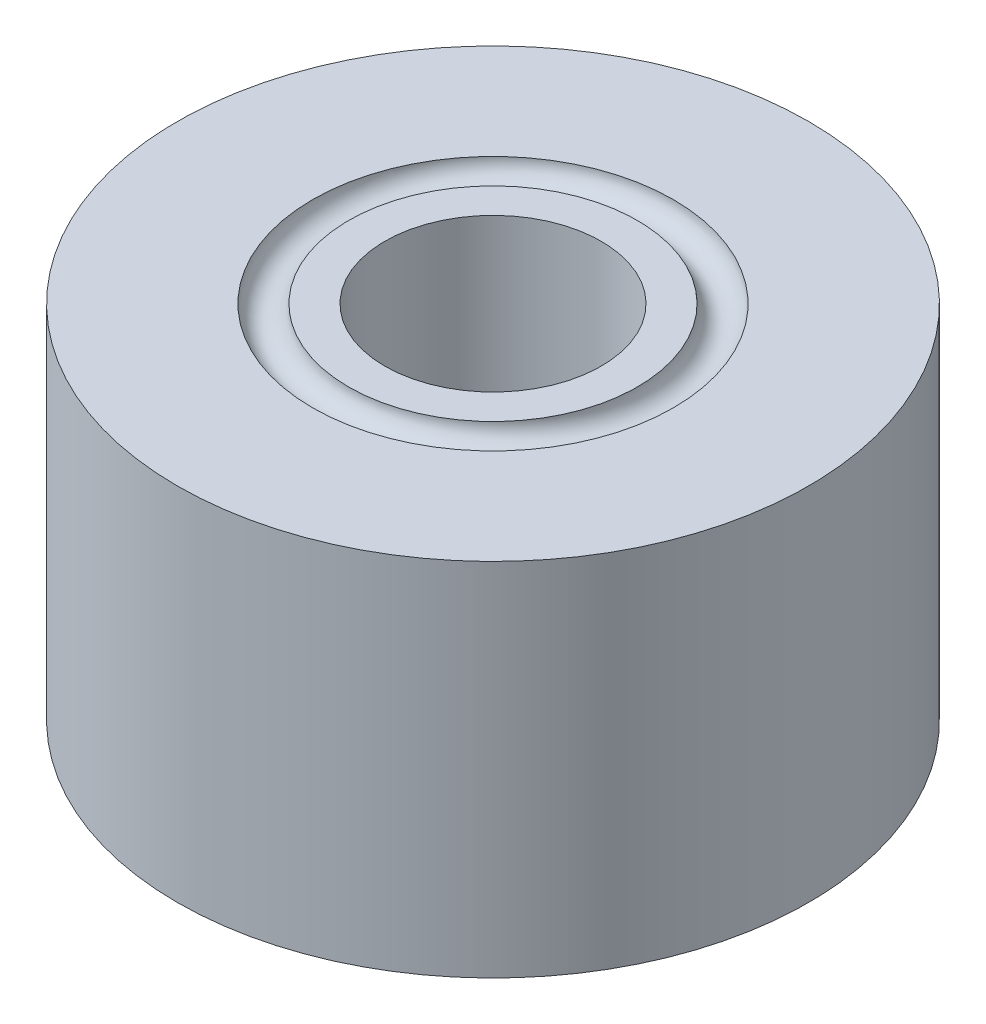
ISO-10303-21;
HEADER;
FILE_DESCRIPTION(('STEP AP214'),'2;1');
FILE_NAME('part.step','',(''),(''),'','','');
FILE_SCHEMA(('AUTOMOTIVE_DESIGN { 1 0 10303 214 1 1 1 1 }'));
ENDSEC;
DATA;
#1=APPLICATION_CONTEXT('core data for automotive mechanical design processes');
#2=APPLICATION_PROTOCOL_DEFINITION('international standard','automotive_design',2000,#1);
#3=PRODUCT_CONTEXT('',#1,'mechanical');
#4=PRODUCT('Part','Part','',(#3));
#5=PRODUCT_RELATED_PRODUCT_CATEGORY('part','',(#4));
#6=PRODUCT_DEFINITION_FORMATION('','',#4);
#7=PRODUCT_DEFINITION_CONTEXT('part definition',#1,'design');
#8=PRODUCT_DEFINITION('design','',#6,#7);
#9=PRODUCT_DEFINITION_SHAPE('','',#8);
#10=(LENGTH_UNIT() NAMED_UNIT(*) SI_UNIT(.MILLI.,.METRE.));
#11=(NAMED_UNIT(*) PLANE_ANGLE_UNIT() SI_UNIT($,.RADIAN.));
#12=(NAMED_UNIT(*) SI_UNIT($,.STERADIAN.) SOLID_ANGLE_UNIT());
#13=UNCERTAINTY_MEASURE_WITH_UNIT(LENGTH_MEASURE(1.E-05),#10,'distance_accuracy_value','');
#14=(GEOMETRIC_REPRESENTATION_CONTEXT(3) GLOBAL_UNCERTAINTY_ASSIGNED_CONTEXT((#13)) GLOBAL_UNIT_ASSIGNED_CONTEXT((#10,
#11,#12)) REPRESENTATION_CONTEXT('',''));
#15=CARTESIAN_POINT('',(0.,0.,0.));
#16=DIRECTION('',(0.,0.,1.));
#17=DIRECTION('',(1.,0.,0.));
#18=AXIS2_PLACEMENT_3D('',#15,#16,#17);
#19=CARTESIAN_POINT('',(0.,20.,0.));
#20=DIRECTION('',(0.,-1.,0.));
#21=DIRECTION('',(0.,0.,-1.));
#22=AXIS2_PLACEMENT_3D('',#19,#20,#21);
#23=CYLINDRICAL_SURFACE('',#22,2.5);
#24=CARTESIAN_POINT('',(0.,0.,0.));
#25=DIRECTION('',(0.,1.,0.));
#26=DIRECTION('',(0.,0.,1.));
#27=AXIS2_PLACEMENT_3D('',#24,#25,#26);
#28=CIRCLE('',#27,2.5);
#29=CARTESIAN_POINT('',(0.,0.,2.5));
#30=VERTEX_POINT('',#29);
#31=EDGE_CURVE('E65',#30,#30,#28,.T.);
#32=ORIENTED_EDGE('',*,*,#31,.F.);
#33=EDGE_LOOP('',(#32));
#34=FACE_BOUND('',#33,.T.);
#35=CARTESIAN_POINT('',(0.,9.,0.));
#36=DIRECTION('',(0.,1.,0.));
#37=DIRECTION('',(0.,0.,1.));
#38=AXIS2_PLACEMENT_3D('',#35,#36,#37);
#39=CIRCLE('',#38,2.5);
#40=CARTESIAN_POINT('',(0.,9.,2.5));
#41=VERTEX_POINT('',#40);
#42=EDGE_CURVE('E49',#41,#41,#39,.T.);
#43=ORIENTED_EDGE('',*,*,#42,.T.);
#44=EDGE_LOOP('',(#43));
#45=FACE_BOUND('',#44,.T.);
#46=ADVANCED_FACE('F45',(#34,#45),#23,.F.);
#47=CARTESIAN_POINT('',(0.,20.,0.));
#48=DIRECTION('',(0.,1.,0.));
#49=DIRECTION('',(0.,0.,1.));
#50=AXIS2_PLACEMENT_3D('',#47,#48,#49);
#51=PLANE('',#50);
#52=CARTESIAN_POINT('',(0.,20.,0.));
#53=DIRECTION('',(0.,1.,0.));
#54=DIRECTION('',(0.,0.,1.));
#55=AXIS2_PLACEMENT_3D('',#52,#53,#54);
#56=CIRCLE('',#55,17.5);
#57=CARTESIAN_POINT('',(0.,20.,17.5));
#58=VERTEX_POINT('',#57);
#59=EDGE_CURVE('E68',#58,#58,#56,.T.);
#60=ORIENTED_EDGE('',*,*,#59,.T.);
#61=EDGE_LOOP('',(#60));
#62=FACE_BOUND('',#61,.T.);
#63=CARTESIAN_POINT('',(0.,20.,0.));
#64=DIRECTION('',(0.,1.,0.));
#65=DIRECTION('',(0.,0.,1.));
#66=AXIS2_PLACEMENT_3D('',#63,#64,#65);
#67=CIRCLE('',#66,10.);
#68=CARTESIAN_POINT('',(0.,20.,10.));
#69=VERTEX_POINT('',#68);
#70=EDGE_CURVE('E12',#69,#69,#67,.T.);
#71=ORIENTED_EDGE('',*,*,#70,.F.);
#72=EDGE_LOOP('',(#71));
#73=FACE_BOUND('',#72,.T.);
#74=ADVANCED_FACE('F78',(#62,#73),#51,.T.);
#75=CARTESIAN_POINT('',(0.,20.,0.));
#76=DIRECTION('',(0.,-1.,0.));
#77=DIRECTION('',(0.,0.,-1.));
#78=AXIS2_PLACEMENT_3D('',#75,#76,#77);
#79=CYLINDRICAL_SURFACE('',#78,17.5);
#80=ORIENTED_EDGE('',*,*,#59,.F.);
#81=EDGE_LOOP('',(#80));
#82=FACE_BOUND('',#81,.T.);
#83=CARTESIAN_POINT('',(0.,0.,0.));
#84=DIRECTION('',(0.,1.,0.));
#85=DIRECTION('',(0.,0.,1.));
#86=AXIS2_PLACEMENT_3D('',#83,#84,#85);
#87=CIRCLE('',#86,17.5);
#88=CARTESIAN_POINT('',(0.,0.,17.5));
#89=VERTEX_POINT('',#88);
#90=EDGE_CURVE('E64',#89,#89,#87,.T.);
#91=ORIENTED_EDGE('',*,*,#90,.T.);
#92=EDGE_LOOP('',(#91));
#93=FACE_BOUND('',#92,.T.);
#94=ADVANCED_FACE('F47',(#82,#93),#79,.T.);
#95=CARTESIAN_POINT('',(0.,0.,0.));
#96=DIRECTION('',(0.,1.,0.));
#97=DIRECTION('',(0.,0.,1.));
#98=AXIS2_PLACEMENT_3D('',#95,#96,#97);
#99=PLANE('',#98);
#100=ORIENTED_EDGE('',*,*,#31,.T.);
#101=EDGE_LOOP('',(#100));
#102=FACE_BOUND('',#101,.T.);
#103=ORIENTED_EDGE('',*,*,#90,.F.);
#104=EDGE_LOOP('',(#103));
#105=FACE_BOUND('',#104,.T.);
#106=ADVANCED_FACE('F83',(#102,#105),#99,.F.);
#107=CARTESIAN_POINT('',(0.,20.,0.));
#108=DIRECTION('',(0.,1.,0.));
#109=DIRECTION('',(0.,0.,1.));
#110=AXIS2_PLACEMENT_3D('',#107,#108,#109);
#111=TOROIDAL_SURFACE('',#110,9.,0.999999999999999);
#112=ORIENTED_EDGE('',*,*,#70,.T.);
#113=CARTESIAN_POINT('',(0.,20.,9.));
#114=DIRECTION('',(1.,0.,0.));
#115=DIRECTION('',(0.,1.,0.));
#116=AXIS2_PLACEMENT_3D('',#113,#114,#115);
#117=CIRCLE('',#116,0.999999999999999);
#118=CARTESIAN_POINT('',(0.,20.,8.));
#119=VERTEX_POINT('',#118);
#120=EDGE_CURVE('E60',#69,#119,#117,.T.);
#121=ORIENTED_EDGE('',*,*,#120,.T.);
#122=CARTESIAN_POINT('',(0.,20.,0.));
#123=DIRECTION('',(0.,-1.,0.));
#124=DIRECTION('',(0.,0.,-1.));
#125=AXIS2_PLACEMENT_3D('',#122,#123,#124);
#126=CIRCLE('',#125,8.);
#127=EDGE_CURVE('E54',#119,#119,#126,.T.);
#128=ORIENTED_EDGE('',*,*,#127,.T.);
#129=ORIENTED_EDGE('',*,*,#120,.F.);
#130=EDGE_LOOP('',(#112,#121,#128,#129));
#131=FACE_BOUND('',#130,.T.);
#132=ADVANCED_FACE('F61',(#131),#111,.F.);
#133=CARTESIAN_POINT('',(0.,20.,0.));
#134=DIRECTION('',(0.,1.,0.));
#135=DIRECTION('',(0.,0.,1.));
#136=AXIS2_PLACEMENT_3D('',#133,#134,#135);
#137=CIRCLE('',#136,6.);
#138=CARTESIAN_POINT('',(0.,20.,6.));
#139=VERTEX_POINT('',#138);
#140=EDGE_CURVE('E118',#139,#139,#137,.T.);
#141=ORIENTED_EDGE('',*,*,#140,.F.);
#142=EDGE_LOOP('',(#141));
#143=FACE_BOUND('',#142,.T.);
#144=ORIENTED_EDGE('',*,*,#127,.F.);
#145=EDGE_LOOP('',(#144));
#146=FACE_BOUND('',#145,.T.);
#147=ADVANCED_FACE('F91',(#143,#146),#51,.T.);
#148=CARTESIAN_POINT('',(0.,9.,0.));
#149=DIRECTION('',(0.,1.,0.));
#150=DIRECTION('',(0.,0.,1.));
#151=AXIS2_PLACEMENT_3D('',#148,#149,#150);
#152=CYLINDRICAL_SURFACE('',#151,6.);
#153=CARTESIAN_POINT('',(0.,9.,0.));
#154=DIRECTION('',(0.,1.,0.));
#155=DIRECTION('',(0.,0.,1.));
#156=AXIS2_PLACEMENT_3D('',#153,#154,#155);
#157=CIRCLE('',#156,6.);
#158=CARTESIAN_POINT('',(0.,9.,6.));
#159=VERTEX_POINT('',#158);
#160=EDGE_CURVE('E117',#159,#159,#157,.T.);
#161=ORIENTED_EDGE('',*,*,#160,.F.);
#162=EDGE_LOOP('',(#161));
#163=FACE_BOUND('',#162,.T.);
#164=ORIENTED_EDGE('',*,*,#140,.T.);
#165=EDGE_LOOP('',(#164));
#166=FACE_BOUND('',#165,.T.);
#167=ADVANCED_FACE('F103',(#163,#166),#152,.F.);
#168=CARTESIAN_POINT('',(0.,9.,0.));
#169=DIRECTION('',(0.,1.,0.));
#170=DIRECTION('',(0.,0.,1.));
#171=AXIS2_PLACEMENT_3D('',#168,#169,#170);
#172=PLANE('',#171);
#173=ORIENTED_EDGE('',*,*,#42,.F.);
#174=EDGE_LOOP('',(#173));
#175=FACE_BOUND('',#174,.T.);
#176=ORIENTED_EDGE('',*,*,#160,.T.);
#177=EDGE_LOOP('',(#176));
#178=FACE_BOUND('',#177,.T.);
#179=ADVANCED_FACE('F106',(#175,#178),#172,.T.);
#180=CLOSED_SHELL('',(#46,#74,#94,#106,#132,#147,#167,#179));
#181=MANIFOLD_SOLID_BREP('B2',#180);
#182=ADVANCED_BREP_SHAPE_REPRESENTATION('',(#18,#181),#14);
#183=SHAPE_DEFINITION_REPRESENTATION(#9,#182);
ENDSEC;
END-ISO-10303-21;
